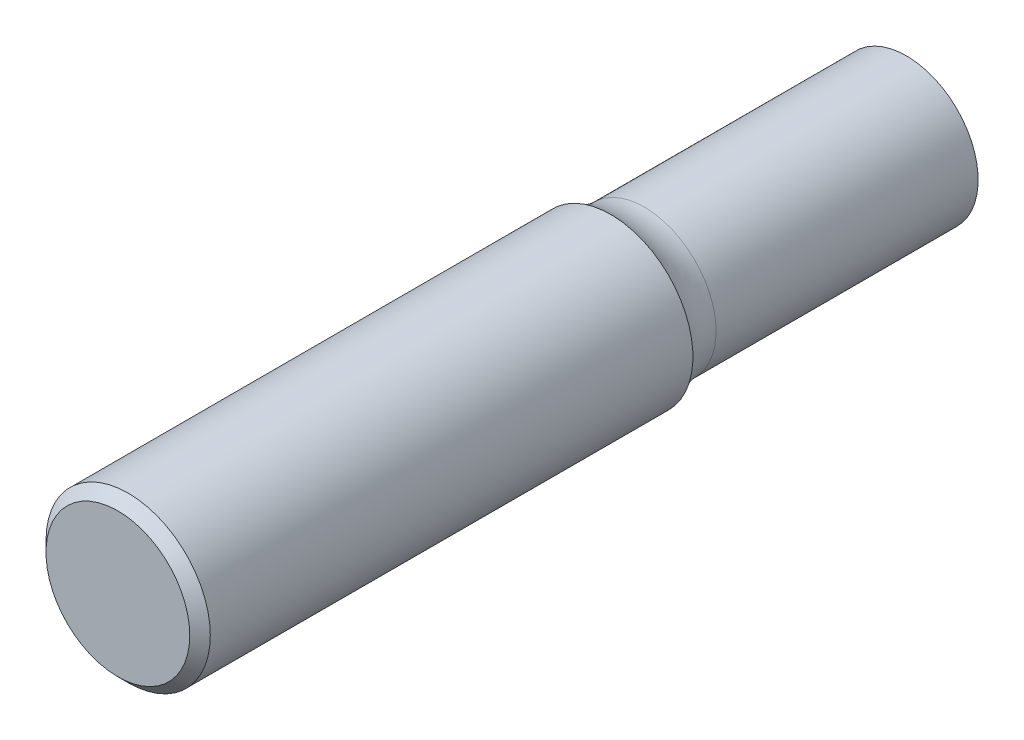
ISO-10303-21;
HEADER;
FILE_DESCRIPTION(('STEP AP214'),'2;1');
FILE_NAME('part.step','',(''),(''),'','','');
FILE_SCHEMA(('AUTOMOTIVE_DESIGN { 1 0 10303 214 1 1 1 1 }'));
ENDSEC;
DATA;
#1=APPLICATION_CONTEXT('core data for automotive mechanical design processes');
#2=APPLICATION_PROTOCOL_DEFINITION('international standard','automotive_design',2000,#1);
#3=PRODUCT_CONTEXT('',#1,'mechanical');
#4=PRODUCT('Part','Part','',(#3));
#5=PRODUCT_RELATED_PRODUCT_CATEGORY('part','',(#4));
#6=PRODUCT_DEFINITION_FORMATION('','',#4);
#7=PRODUCT_DEFINITION_CONTEXT('part definition',#1,'design');
#8=PRODUCT_DEFINITION('design','',#6,#7);
#9=PRODUCT_DEFINITION_SHAPE('','',#8);
#10=(LENGTH_UNIT() NAMED_UNIT(*) SI_UNIT(.MILLI.,.METRE.));
#11=(NAMED_UNIT(*) PLANE_ANGLE_UNIT() SI_UNIT($,.RADIAN.));
#12=(NAMED_UNIT(*) SI_UNIT($,.STERADIAN.) SOLID_ANGLE_UNIT());
#13=UNCERTAINTY_MEASURE_WITH_UNIT(LENGTH_MEASURE(1.E-05),#10,'distance_accuracy_value','');
#14=(GEOMETRIC_REPRESENTATION_CONTEXT(3) GLOBAL_UNCERTAINTY_ASSIGNED_CONTEXT((#13)) GLOBAL_UNIT_ASSIGNED_CONTEXT((#10,
#11,#12)) REPRESENTATION_CONTEXT('',''));
#15=CARTESIAN_POINT('',(0.,0.,0.));
#16=DIRECTION('',(0.,0.,1.));
#17=DIRECTION('',(1.,0.,0.));
#18=AXIS2_PLACEMENT_3D('',#15,#16,#17);
#19=CARTESIAN_POINT('',(0.,2.76859999999999,-15.24));
#20=DIRECTION('',(0.,0.,-1.));
#21=DIRECTION('',(-1.,0.,0.));
#22=AXIS2_PLACEMENT_3D('',#19,#20,#21);
#23=PLANE('',#22);
#24=CARTESIAN_POINT('',(0.,0.,-15.24));
#25=DIRECTION('',(0.,0.,-1.));
#26=DIRECTION('',(-1.,0.,0.));
#27=AXIS2_PLACEMENT_3D('',#24,#25,#26);
#28=CIRCLE('',#27,1.72271181571383);
#29=CARTESIAN_POINT('',(-1.72271181571383,0.,-15.24));
#30=VERTEX_POINT('',#29);
#31=EDGE_CURVE('E60',#30,#30,#28,.T.);
#32=ORIENTED_EDGE('',*,*,#31,.F.);
#33=EDGE_LOOP('',(#32));
#34=FACE_BOUND('',#33,.T.);
#35=CARTESIAN_POINT('',(0.,0.,-15.24));
#36=DIRECTION('',(0.,0.,-1.));
#37=DIRECTION('',(-1.,0.,0.));
#38=AXIS2_PLACEMENT_3D('',#35,#36,#37);
#39=CIRCLE('',#38,2.7686);
#40=CARTESIAN_POINT('',(-2.7686,0.,-15.24));
#41=VERTEX_POINT('',#40);
#42=EDGE_CURVE('E48',#41,#41,#39,.T.);
#43=ORIENTED_EDGE('',*,*,#42,.T.);
#44=EDGE_LOOP('',(#43));
#45=FACE_BOUND('',#44,.T.);
#46=ADVANCED_FACE('F36',(#34,#45),#23,.T.);
#47=CARTESIAN_POINT('',(0.,0.,-127.));
#48=DIRECTION('',(0.,0.,-1.));
#49=DIRECTION('',(-1.,0.,0.));
#50=AXIS2_PLACEMENT_3D('',#47,#48,#49);
#51=CYLINDRICAL_SURFACE('',#50,2.7686);
#52=CARTESIAN_POINT('',(0.,0.,-5.11111484504635));
#53=DIRECTION('',(0.,0.,-1.));
#54=DIRECTION('',(-1.,0.,0.));
#55=AXIS2_PLACEMENT_3D('',#52,#53,#54);
#56=CIRCLE('',#55,2.7686);
#57=CARTESIAN_POINT('',(-2.7686,0.,-5.11111484504635));
#58=VERTEX_POINT('',#57);
#59=EDGE_CURVE('E52',#58,#58,#56,.T.);
#60=ORIENTED_EDGE('',*,*,#59,.T.);
#61=EDGE_LOOP('',(#60));
#62=FACE_BOUND('',#61,.T.);
#63=ORIENTED_EDGE('',*,*,#42,.F.);
#64=EDGE_LOOP('',(#63));
#65=FACE_BOUND('',#64,.T.);
#66=ADVANCED_FACE('F68',(#62,#65),#51,.T.);
#67=CARTESIAN_POINT('',(0.,0.,-5.11111484504635));
#68=DIRECTION('',(0.,0.,-1.));
#69=DIRECTION('',(-1.,0.,0.));
#70=AXIS2_PLACEMENT_3D('',#67,#68,#69);
#71=TOROIDAL_SURFACE('',#70,5.0546,2.286);
#72=CARTESIAN_POINT('',(0.,0.,-3.80999999999999));
#73=DIRECTION('',(0.,0.,-1.));
#74=DIRECTION('',(-1.,0.,0.));
#75=AXIS2_PLACEMENT_3D('',#72,#73,#74);
#76=CIRCLE('',#75,3.17499999999999);
#77=CARTESIAN_POINT('',(-3.17499999999999,0.,-3.80999999999999));
#78=VERTEX_POINT('',#77);
#79=EDGE_CURVE('E57',#78,#78,#76,.T.);
#80=ORIENTED_EDGE('',*,*,#79,.T.);
#81=EDGE_LOOP('',(#80));
#82=FACE_BOUND('',#81,.T.);
#83=ORIENTED_EDGE('',*,*,#59,.F.);
#84=EDGE_LOOP('',(#83));
#85=FACE_BOUND('',#84,.T.);
#86=ADVANCED_FACE('F72',(#82,#85),#71,.F.);
#87=CARTESIAN_POINT('',(0.,0.,-127.));
#88=DIRECTION('',(0.,0.,-1.));
#89=DIRECTION('',(-1.,0.,0.));
#90=AXIS2_PLACEMENT_3D('',#87,#88,#89);
#91=CYLINDRICAL_SURFACE('',#90,3.17499999999999);
#92=CARTESIAN_POINT('',(0.,0.,14.843125));
#93=DIRECTION('',(0.,0.,1.));
#94=DIRECTION('',(1.,0.,0.));
#95=AXIS2_PLACEMENT_3D('',#92,#93,#94);
#96=CIRCLE('',#95,3.17499999999999);
#97=CARTESIAN_POINT('',(3.17499999999999,0.,14.843125));
#98=VERTEX_POINT('',#97);
#99=EDGE_CURVE('E44',#98,#98,#96,.F.);
#100=ORIENTED_EDGE('',*,*,#99,.T.);
#101=EDGE_LOOP('',(#100));
#102=FACE_BOUND('',#101,.T.);
#103=ORIENTED_EDGE('',*,*,#79,.F.);
#104=EDGE_LOOP('',(#103));
#105=FACE_BOUND('',#104,.T.);
#106=ADVANCED_FACE('F78',(#102,#105),#91,.T.);
#107=CARTESIAN_POINT('',(0.,0.,15.24));
#108=DIRECTION('',(0.,0.,1.));
#109=DIRECTION('',(1.,0.,0.));
#110=AXIS2_PLACEMENT_3D('',#107,#108,#109);
#111=PLANE('',#110);
#112=CARTESIAN_POINT('',(0.,0.,15.24));
#113=DIRECTION('',(0.,0.,1.));
#114=DIRECTION('',(1.,0.,0.));
#115=AXIS2_PLACEMENT_3D('',#112,#113,#114);
#116=CIRCLE('',#115,2.77812499999998);
#117=CARTESIAN_POINT('',(2.77812499999998,0.,15.24));
#118=VERTEX_POINT('',#117);
#119=EDGE_CURVE('E10',#118,#118,#116,.T.);
#120=ORIENTED_EDGE('',*,*,#119,.T.);
#121=EDGE_LOOP('',(#120));
#122=FACE_BOUND('',#121,.T.);
#123=ADVANCED_FACE('F84',(#122),#111,.T.);
#124=CARTESIAN_POINT('',(0.,0.,-17.907));
#125=DIRECTION('',(0.,0.,-1.));
#126=DIRECTION('',(0.,-1.,0.));
#127=AXIS2_PLACEMENT_3D('',#124,#125,#126);
#128=SPHERICAL_SURFACE('',#127,3.175);
#129=ORIENTED_EDGE('',*,*,#31,.T.);
#130=EDGE_LOOP('',(#129));
#131=FACE_BOUND('',#130,.T.);
#132=ADVANCED_FACE('F64',(#131),#128,.F.);
#133=CARTESIAN_POINT('',(0.,0.,14.843125));
#134=DIRECTION('',(0.,0.,-1.));
#135=DIRECTION('',(-1.,0.,0.));
#136=AXIS2_PLACEMENT_3D('',#133,#134,#135);
#137=CONICAL_SURFACE('',#136,3.17499999999999,0.78539816339744);
#138=ORIENTED_EDGE('',*,*,#119,.F.);
#139=EDGE_LOOP('',(#138));
#140=FACE_BOUND('',#139,.T.);
#141=ORIENTED_EDGE('',*,*,#99,.F.);
#142=EDGE_LOOP('',(#141));
#143=FACE_BOUND('',#142,.T.);
#144=ADVANCED_FACE('F39',(#140,#143),#137,.T.);
#145=CLOSED_SHELL('',(#46,#66,#86,#106,#123,#132,#144));
#146=MANIFOLD_SOLID_BREP('B2',#145);
#147=ADVANCED_BREP_SHAPE_REPRESENTATION('',(#18,#146),#14);
#148=SHAPE_DEFINITION_REPRESENTATION(#9,#147);
ENDSEC;
END-ISO-10303-21;
